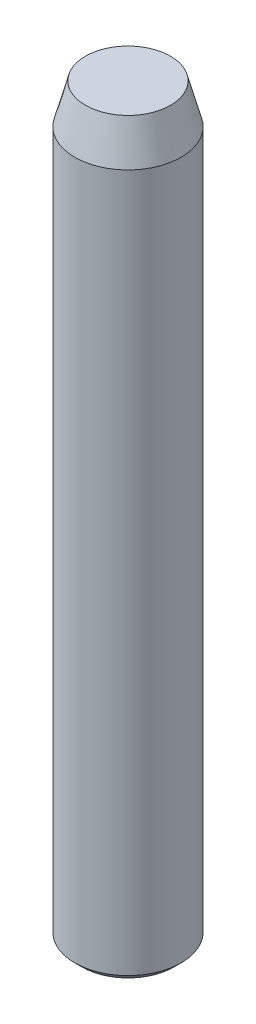
ISO-10303-21;
HEADER;
FILE_DESCRIPTION(('STEP AP214'),'2;1');
FILE_NAME('part.step','',(''),(''),'','','');
FILE_SCHEMA(('AUTOMOTIVE_DESIGN { 1 0 10303 214 1 1 1 1 }'));
ENDSEC;
DATA;
#1=APPLICATION_CONTEXT('core data for automotive mechanical design processes');
#2=APPLICATION_PROTOCOL_DEFINITION('international standard','automotive_design',2000,#1);
#3=PRODUCT_CONTEXT('',#1,'mechanical');
#4=PRODUCT('Part','Part','',(#3));
#5=PRODUCT_RELATED_PRODUCT_CATEGORY('part','',(#4));
#6=PRODUCT_DEFINITION_FORMATION('','',#4);
#7=PRODUCT_DEFINITION_CONTEXT('part definition',#1,'design');
#8=PRODUCT_DEFINITION('design','',#6,#7);
#9=PRODUCT_DEFINITION_SHAPE('','',#8);
#10=(LENGTH_UNIT() NAMED_UNIT(*) SI_UNIT(.MILLI.,.METRE.));
#11=(NAMED_UNIT(*) PLANE_ANGLE_UNIT() SI_UNIT($,.RADIAN.));
#12=(NAMED_UNIT(*) SI_UNIT($,.STERADIAN.) SOLID_ANGLE_UNIT());
#13=UNCERTAINTY_MEASURE_WITH_UNIT(LENGTH_MEASURE(1.E-05),#10,'distance_accuracy_value','');
#14=(GEOMETRIC_REPRESENTATION_CONTEXT(3) GLOBAL_UNCERTAINTY_ASSIGNED_CONTEXT((#13)) GLOBAL_UNIT_ASSIGNED_CONTEXT((#10,
#11,#12)) REPRESENTATION_CONTEXT('',''));
#15=CARTESIAN_POINT('',(0.,0.,0.));
#16=DIRECTION('',(0.,0.,1.));
#17=DIRECTION('',(1.,0.,0.));
#18=AXIS2_PLACEMENT_3D('',#15,#16,#17);
#19=CARTESIAN_POINT('',(0.,-210.,0.));
#20=DIRECTION('',(0.,1.,0.));
#21=DIRECTION('',(0.,0.,1.));
#22=AXIS2_PLACEMENT_3D('',#19,#20,#21);
#23=CYLINDRICAL_SURFACE('',#22,15.);
#24=CARTESIAN_POINT('',(0.,-11.1961524227068,0.));
#25=DIRECTION('',(0.,1.,0.));
#26=DIRECTION('',(0.,0.,1.));
#27=AXIS2_PLACEMENT_3D('',#24,#25,#26);
#28=CIRCLE('',#27,15.);
#29=CARTESIAN_POINT('',(0.,-11.1961524227068,15.));
#30=VERTEX_POINT('',#29);
#31=EDGE_CURVE('E10',#30,#30,#28,.F.);
#32=ORIENTED_EDGE('',*,*,#31,.T.);
#33=EDGE_LOOP('',(#32));
#34=FACE_BOUND('',#33,.T.);
#35=CARTESIAN_POINT('',(0.,-208.,0.));
#36=DIRECTION('',(0.,1.,0.));
#37=DIRECTION('',(0.,0.,1.));
#38=AXIS2_PLACEMENT_3D('',#35,#36,#37);
#39=CIRCLE('',#38,15.);
#40=CARTESIAN_POINT('',(0.,-208.,15.));
#41=VERTEX_POINT('',#40);
#42=EDGE_CURVE('E55',#41,#41,#39,.T.);
#43=ORIENTED_EDGE('',*,*,#42,.T.);
#44=EDGE_LOOP('',(#43));
#45=FACE_BOUND('',#44,.T.);
#46=ADVANCED_FACE('F39',(#34,#45),#23,.T.);
#47=CARTESIAN_POINT('',(0.,-210.,0.));
#48=DIRECTION('',(0.,1.,0.));
#49=DIRECTION('',(0.,0.,1.));
#50=AXIS2_PLACEMENT_3D('',#47,#48,#49);
#51=PLANE('',#50);
#52=CARTESIAN_POINT('',(0.,-210.,0.));
#53=DIRECTION('',(0.,1.,0.));
#54=DIRECTION('',(0.,0.,1.));
#55=AXIS2_PLACEMENT_3D('',#52,#53,#54);
#56=CIRCLE('',#55,13.);
#57=CARTESIAN_POINT('',(0.,-210.,13.));
#58=VERTEX_POINT('',#57);
#59=EDGE_CURVE('E51',#58,#58,#56,.F.);
#60=ORIENTED_EDGE('',*,*,#59,.T.);
#61=EDGE_LOOP('',(#60));
#62=FACE_BOUND('',#61,.T.);
#63=ADVANCED_FACE('F73',(#62),#51,.F.);
#64=CARTESIAN_POINT('',(0.,0.,0.));
#65=DIRECTION('',(0.,1.,0.));
#66=DIRECTION('',(0.,0.,1.));
#67=AXIS2_PLACEMENT_3D('',#64,#65,#66);
#68=PLANE('',#67);
#69=CARTESIAN_POINT('',(0.,0.,0.));
#70=DIRECTION('',(0.,1.,0.));
#71=DIRECTION('',(0.,0.,1.));
#72=AXIS2_PLACEMENT_3D('',#69,#70,#71);
#73=CIRCLE('',#72,11.9999999999999);
#74=CARTESIAN_POINT('',(0.,0.,11.9999999999999));
#75=VERTEX_POINT('',#74);
#76=EDGE_CURVE('E47',#75,#75,#73,.T.);
#77=ORIENTED_EDGE('',*,*,#76,.T.);
#78=EDGE_LOOP('',(#77));
#79=FACE_BOUND('',#78,.T.);
#80=ADVANCED_FACE('F64',(#79),#68,.T.);
#81=CARTESIAN_POINT('',(0.,-208.,0.));
#82=DIRECTION('',(0.,1.,0.));
#83=DIRECTION('',(0.,0.,1.));
#84=AXIS2_PLACEMENT_3D('',#81,#82,#83);
#85=CONICAL_SURFACE('',#84,15.,0.785398163397452);
#86=ORIENTED_EDGE('',*,*,#59,.F.);
#87=EDGE_LOOP('',(#86));
#88=FACE_BOUND('',#87,.T.);
#89=ORIENTED_EDGE('',*,*,#42,.F.);
#90=EDGE_LOOP('',(#89));
#91=FACE_BOUND('',#90,.T.);
#92=ADVANCED_FACE('F62',(#88,#91),#85,.T.);
#93=CARTESIAN_POINT('',(0.,0.,0.));
#94=DIRECTION('',(0.,-1.,0.));
#95=DIRECTION('',(0.,0.,-1.));
#96=AXIS2_PLACEMENT_3D('',#93,#94,#95);
#97=CONICAL_SURFACE('',#96,11.9999999999999,0.26179938779915);
#98=ORIENTED_EDGE('',*,*,#31,.F.);
#99=EDGE_LOOP('',(#98));
#100=FACE_BOUND('',#99,.T.);
#101=ORIENTED_EDGE('',*,*,#76,.F.);
#102=EDGE_LOOP('',(#101));
#103=FACE_BOUND('',#102,.T.);
#104=ADVANCED_FACE('F42',(#100,#103),#97,.T.);
#105=CLOSED_SHELL('',(#46,#63,#80,#92,#104));
#106=MANIFOLD_SOLID_BREP('B2',#105);
#107=ADVANCED_BREP_SHAPE_REPRESENTATION('',(#18,#106),#14);
#108=SHAPE_DEFINITION_REPRESENTATION(#9,#107);
ENDSEC;
END-ISO-10303-21;
